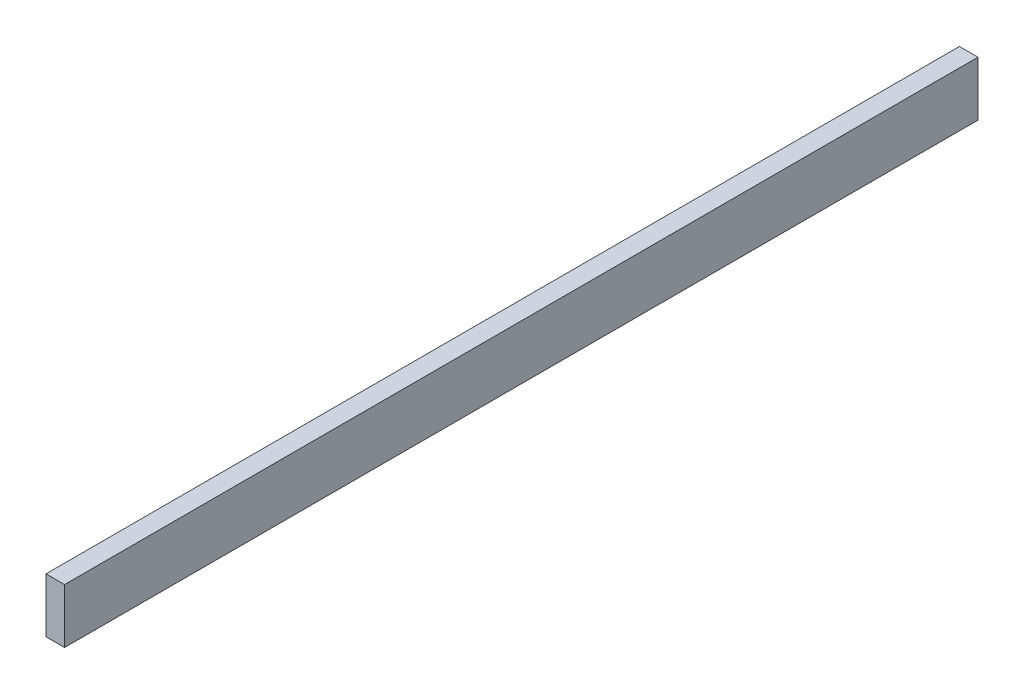
ISO-10303-21;
HEADER;
FILE_DESCRIPTION(('STEP AP214'),'2;1');
FILE_NAME('part.step','',(''),(''),'','','');
FILE_SCHEMA(('AUTOMOTIVE_DESIGN { 1 0 10303 214 1 1 1 1 }'));
ENDSEC;
DATA;
#1=APPLICATION_CONTEXT('core data for automotive mechanical design processes');
#2=APPLICATION_PROTOCOL_DEFINITION('international standard','automotive_design',2000,#1);
#3=PRODUCT_CONTEXT('',#1,'mechanical');
#4=PRODUCT('Part','Part','',(#3));
#5=PRODUCT_RELATED_PRODUCT_CATEGORY('part','',(#4));
#6=PRODUCT_DEFINITION_FORMATION('','',#4);
#7=PRODUCT_DEFINITION_CONTEXT('part definition',#1,'design');
#8=PRODUCT_DEFINITION('design','',#6,#7);
#9=PRODUCT_DEFINITION_SHAPE('','',#8);
#10=(LENGTH_UNIT() NAMED_UNIT(*) SI_UNIT(.MILLI.,.METRE.));
#11=(NAMED_UNIT(*) PLANE_ANGLE_UNIT() SI_UNIT($,.RADIAN.));
#12=(NAMED_UNIT(*) SI_UNIT($,.STERADIAN.) SOLID_ANGLE_UNIT());
#13=UNCERTAINTY_MEASURE_WITH_UNIT(LENGTH_MEASURE(1.E-05),#10,'distance_accuracy_value','');
#14=(GEOMETRIC_REPRESENTATION_CONTEXT(3) GLOBAL_UNCERTAINTY_ASSIGNED_CONTEXT((#13)) GLOBAL_UNIT_ASSIGNED_CONTEXT((#10,
#11,#12)) REPRESENTATION_CONTEXT('',''));
#15=CARTESIAN_POINT('',(0.,0.,0.));
#16=DIRECTION('',(0.,0.,1.));
#17=DIRECTION('',(1.,0.,0.));
#18=AXIS2_PLACEMENT_3D('',#15,#16,#17);
#19=CARTESIAN_POINT('',(-10.16,29.845,1000.));
#20=DIRECTION('',(1.,0.,0.));
#21=DIRECTION('',(0.,1.,0.));
#22=AXIS2_PLACEMENT_3D('',#19,#20,#21);
#23=PLANE('',#22);
#24=DIRECTION('',(0.,-1.,0.));
#25=VECTOR('',#24,1.);
#26=CARTESIAN_POINT('',(-10.16,29.845,0.));
#27=LINE('',#26,#25);
#28=CARTESIAN_POINT('',(-10.16,29.845,0.));
#29=VERTEX_POINT('',#28);
#30=CARTESIAN_POINT('',(-10.16,-29.845,0.));
#31=VERTEX_POINT('',#30);
#32=EDGE_CURVE('E96',#29,#31,#27,.T.);
#33=ORIENTED_EDGE('',*,*,#32,.T.);
#34=DIRECTION('',(0.,0.,-1.));
#35=VECTOR('',#34,1.);
#36=CARTESIAN_POINT('',(-10.16,-29.845,1000.));
#37=LINE('',#36,#35);
#38=CARTESIAN_POINT('',(-10.16,-29.845,1000.));
#39=VERTEX_POINT('',#38);
#40=EDGE_CURVE('E11',#39,#31,#37,.T.);
#41=ORIENTED_EDGE('',*,*,#40,.F.);
#42=DIRECTION('',(0.,-1.,0.));
#43=VECTOR('',#42,1.);
#44=CARTESIAN_POINT('',(-10.16,29.845,1000.));
#45=LINE('',#44,#43);
#46=CARTESIAN_POINT('',(-10.16,29.845,1000.));
#47=VERTEX_POINT('',#46);
#48=EDGE_CURVE('E84',#47,#39,#45,.T.);
#49=ORIENTED_EDGE('',*,*,#48,.F.);
#50=DIRECTION('',(0.,0.,-1.));
#51=VECTOR('',#50,1.);
#52=CARTESIAN_POINT('',(-10.16,29.845,1000.));
#53=LINE('',#52,#51);
#54=EDGE_CURVE('E92',#47,#29,#53,.T.);
#55=ORIENTED_EDGE('',*,*,#54,.T.);
#56=EDGE_LOOP('',(#33,#41,#49,#55));
#57=FACE_BOUND('',#56,.T.);
#58=ADVANCED_FACE('F33',(#57),#23,.F.);
#59=CARTESIAN_POINT('',(10.16,-29.845,1000.));
#60=DIRECTION('',(0.,1.,0.));
#61=DIRECTION('',(0.,0.,1.));
#62=AXIS2_PLACEMENT_3D('',#59,#60,#61);
#63=PLANE('',#62);
#64=DIRECTION('',(1.,0.,0.));
#65=VECTOR('',#64,1.);
#66=CARTESIAN_POINT('',(10.16,-29.845,0.));
#67=LINE('',#66,#65);
#68=CARTESIAN_POINT('',(10.16,-29.845,0.));
#69=VERTEX_POINT('',#68);
#70=EDGE_CURVE('E88',#31,#69,#67,.T.);
#71=ORIENTED_EDGE('',*,*,#70,.T.);
#72=DIRECTION('',(0.,0.,-1.));
#73=VECTOR('',#72,1.);
#74=CARTESIAN_POINT('',(10.16,-29.845,1000.));
#75=LINE('',#74,#73);
#76=CARTESIAN_POINT('',(10.16,-29.845,1000.));
#77=VERTEX_POINT('',#76);
#78=EDGE_CURVE('E41',#77,#69,#75,.T.);
#79=ORIENTED_EDGE('',*,*,#78,.F.);
#80=DIRECTION('',(1.,0.,0.));
#81=VECTOR('',#80,1.);
#82=CARTESIAN_POINT('',(10.16,-29.845,1000.));
#83=LINE('',#82,#81);
#84=EDGE_CURVE('E79',#39,#77,#83,.T.);
#85=ORIENTED_EDGE('',*,*,#84,.F.);
#86=ORIENTED_EDGE('',*,*,#40,.T.);
#87=EDGE_LOOP('',(#71,#79,#85,#86));
#88=FACE_BOUND('',#87,.T.);
#89=ADVANCED_FACE('F87',(#88),#63,.F.);
#90=CARTESIAN_POINT('',(10.16,29.845,1000.));
#91=DIRECTION('',(-1.,0.,0.));
#92=DIRECTION('',(0.,-1.,0.));
#93=AXIS2_PLACEMENT_3D('',#90,#91,#92);
#94=PLANE('',#93);
#95=DIRECTION('',(0.,1.,0.));
#96=VECTOR('',#95,1.);
#97=CARTESIAN_POINT('',(10.16,29.845,0.));
#98=LINE('',#97,#96);
#99=CARTESIAN_POINT('',(10.16,29.845,0.));
#100=VERTEX_POINT('',#99);
#101=EDGE_CURVE('E66',#69,#100,#98,.T.);
#102=ORIENTED_EDGE('',*,*,#101,.T.);
#103=DIRECTION('',(0.,0.,-1.));
#104=VECTOR('',#103,1.);
#105=CARTESIAN_POINT('',(10.16,29.845,1000.));
#106=LINE('',#105,#104);
#107=CARTESIAN_POINT('',(10.16,29.845,1000.));
#108=VERTEX_POINT('',#107);
#109=EDGE_CURVE('E89',#108,#100,#106,.T.);
#110=ORIENTED_EDGE('',*,*,#109,.F.);
#111=DIRECTION('',(0.,1.,0.));
#112=VECTOR('',#111,1.);
#113=CARTESIAN_POINT('',(10.16,29.845,1000.));
#114=LINE('',#113,#112);
#115=EDGE_CURVE('E82',#77,#108,#114,.T.);
#116=ORIENTED_EDGE('',*,*,#115,.F.);
#117=ORIENTED_EDGE('',*,*,#78,.T.);
#118=EDGE_LOOP('',(#102,#110,#116,#117));
#119=FACE_BOUND('',#118,.T.);
#120=ADVANCED_FACE('F90',(#119),#94,.F.);
#121=CARTESIAN_POINT('',(10.16,29.845,1000.));
#122=DIRECTION('',(0.,-1.,0.));
#123=DIRECTION('',(1.,0.,0.));
#124=AXIS2_PLACEMENT_3D('',#121,#122,#123);
#125=PLANE('',#124);
#126=DIRECTION('',(-1.,0.,0.));
#127=VECTOR('',#126,1.);
#128=CARTESIAN_POINT('',(10.16,29.845,0.));
#129=LINE('',#128,#127);
#130=EDGE_CURVE('E72',#100,#29,#129,.T.);
#131=ORIENTED_EDGE('',*,*,#130,.T.);
#132=ORIENTED_EDGE('',*,*,#54,.F.);
#133=DIRECTION('',(-1.,0.,0.));
#134=VECTOR('',#133,1.);
#135=CARTESIAN_POINT('',(10.16,29.845,1000.));
#136=LINE('',#135,#134);
#137=EDGE_CURVE('E49',#108,#47,#136,.T.);
#138=ORIENTED_EDGE('',*,*,#137,.F.);
#139=ORIENTED_EDGE('',*,*,#109,.T.);
#140=EDGE_LOOP('',(#131,#132,#138,#139));
#141=FACE_BOUND('',#140,.T.);
#142=ADVANCED_FACE('F103',(#141),#125,.F.);
#143=CARTESIAN_POINT('',(0.,0.,1000.));
#144=DIRECTION('',(0.,0.,-1.));
#145=DIRECTION('',(-1.,0.,0.));
#146=AXIS2_PLACEMENT_3D('',#143,#144,#145);
#147=PLANE('',#146);
#148=ORIENTED_EDGE('',*,*,#48,.T.);
#149=ORIENTED_EDGE('',*,*,#84,.T.);
#150=ORIENTED_EDGE('',*,*,#115,.T.);
#151=ORIENTED_EDGE('',*,*,#137,.T.);
#152=EDGE_LOOP('',(#148,#149,#150,#151));
#153=FACE_BOUND('',#152,.T.);
#154=ADVANCED_FACE('F80',(#153),#147,.F.);
#155=CARTESIAN_POINT('',(0.,0.,0.));
#156=DIRECTION('',(0.,0.,-1.));
#157=DIRECTION('',(-1.,0.,0.));
#158=AXIS2_PLACEMENT_3D('',#155,#156,#157);
#159=PLANE('',#158);
#160=ORIENTED_EDGE('',*,*,#32,.F.);
#161=ORIENTED_EDGE('',*,*,#130,.F.);
#162=ORIENTED_EDGE('',*,*,#101,.F.);
#163=ORIENTED_EDGE('',*,*,#70,.F.);
#164=EDGE_LOOP('',(#160,#161,#162,#163));
#165=FACE_BOUND('',#164,.T.);
#166=ADVANCED_FACE('F106',(#165),#159,.T.);
#167=CLOSED_SHELL('',(#58,#89,#120,#142,#154,#166));
#168=MANIFOLD_SOLID_BREP('B2',#167);
#169=ADVANCED_BREP_SHAPE_REPRESENTATION('',(#18,#168),#14);
#170=SHAPE_DEFINITION_REPRESENTATION(#9,#169);
ENDSEC;
END-ISO-10303-21;
